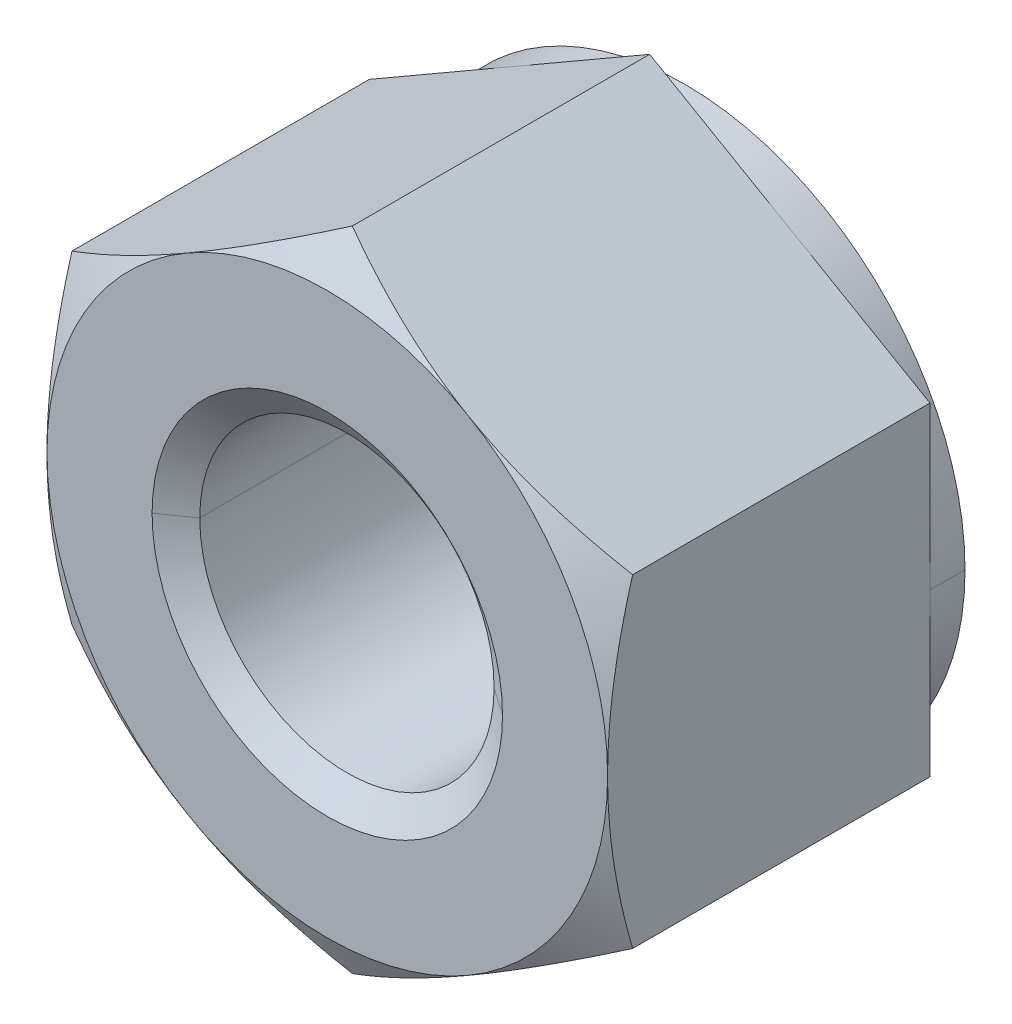
ISO-10303-21;
HEADER;
FILE_DESCRIPTION(('STEP AP214'),'2;1');
FILE_NAME('part.step','',(''),(''),'','','');
FILE_SCHEMA(('AUTOMOTIVE_DESIGN { 1 0 10303 214 1 1 1 1 }'));
ENDSEC;
DATA;
#1=APPLICATION_CONTEXT('core data for automotive mechanical design processes');
#2=APPLICATION_PROTOCOL_DEFINITION('international standard','automotive_design',2000,#1);
#3=PRODUCT_CONTEXT('',#1,'mechanical');
#4=PRODUCT('Part','Part','',(#3));
#5=PRODUCT_RELATED_PRODUCT_CATEGORY('part','',(#4));
#6=PRODUCT_DEFINITION_FORMATION('','',#4);
#7=PRODUCT_DEFINITION_CONTEXT('part definition',#1,'design');
#8=PRODUCT_DEFINITION('design','',#6,#7);
#9=PRODUCT_DEFINITION_SHAPE('','',#8);
#10=(LENGTH_UNIT() NAMED_UNIT(*) SI_UNIT(.MILLI.,.METRE.));
#11=(NAMED_UNIT(*) PLANE_ANGLE_UNIT() SI_UNIT($,.RADIAN.));
#12=(NAMED_UNIT(*) SI_UNIT($,.STERADIAN.) SOLID_ANGLE_UNIT());
#13=UNCERTAINTY_MEASURE_WITH_UNIT(LENGTH_MEASURE(1.E-05),#10,'distance_accuracy_value','');
#14=(GEOMETRIC_REPRESENTATION_CONTEXT(3) GLOBAL_UNCERTAINTY_ASSIGNED_CONTEXT((#13)) GLOBAL_UNIT_ASSIGNED_CONTEXT((#10,
#11,#12)) REPRESENTATION_CONTEXT('',''));
#15=CARTESIAN_POINT('',(0.,0.,0.));
#16=DIRECTION('',(0.,0.,1.));
#17=DIRECTION('',(1.,0.,0.));
#18=AXIS2_PLACEMENT_3D('',#15,#16,#17);
#19=CARTESIAN_POINT('',(0.,0.,-25.0375057290932));
#20=DIRECTION('',(0.,0.,1.));
#21=DIRECTION('',(1.,0.,0.));
#22=AXIS2_PLACEMENT_3D('',#19,#20,#21);
#23=CYLINDRICAL_SURFACE('',#22,2.5);
#24=DIRECTION('',(0.,0.,1.));
#25=VECTOR('',#24,1.);
#26=CARTESIAN_POINT('',(-2.5,0.,-25.0375057290932));
#27=LINE('',#26,#25);
#28=CARTESIAN_POINT('',(-2.5,0.,-5.1));
#29=VERTEX_POINT('',#28);
#30=CARTESIAN_POINT('',(-2.5,0.,-5.0746));
#31=VERTEX_POINT('',#30);
#32=EDGE_CURVE('E271',#29,#31,#27,.T.);
#33=ORIENTED_EDGE('',*,*,#32,.F.);
#34=CARTESIAN_POINT('',(0.,0.,-5.1));
#35=DIRECTION('',(0.,0.,1.));
#36=DIRECTION('',(-1.,0.,0.));
#37=AXIS2_PLACEMENT_3D('',#34,#35,#36);
#38=CIRCLE('',#37,2.5);
#39=CARTESIAN_POINT('',(2.5,0.,-5.1));
#40=VERTEX_POINT('',#39);
#41=EDGE_CURVE('E216',#40,#29,#38,.T.);
#42=ORIENTED_EDGE('',*,*,#41,.F.);
#43=DIRECTION('',(0.,0.,1.));
#44=VECTOR('',#43,1.);
#45=CARTESIAN_POINT('',(2.5,0.,-25.0375057290932));
#46=LINE('',#45,#44);
#47=CARTESIAN_POINT('',(2.5,0.,-5.0746));
#48=VERTEX_POINT('',#47);
#49=EDGE_CURVE('E288',#40,#48,#46,.T.);
#50=ORIENTED_EDGE('',*,*,#49,.T.);
#51=CARTESIAN_POINT('',(0.,0.,-5.0746));
#52=DIRECTION('',(0.,0.,1.));
#53=DIRECTION('',(1.,0.,0.));
#54=AXIS2_PLACEMENT_3D('',#51,#52,#53);
#55=CIRCLE('',#54,2.5);
#56=EDGE_CURVE('E10',#48,#31,#55,.T.);
#57=ORIENTED_EDGE('',*,*,#56,.T.);
#58=EDGE_LOOP('',(#33,#42,#50,#57));
#59=FACE_BOUND('',#58,.T.);
#60=ADVANCED_FACE('F16',(#59),#23,.F.);
#61=CARTESIAN_POINT('',(0.,0.,-5.0746));
#62=DIRECTION('',(0.,0.,-1.));
#63=DIRECTION('',(-1.,0.,0.));
#64=AXIS2_PLACEMENT_3D('',#61,#62,#63);
#65=CONICAL_SURFACE('',#64,2.5,0.959931088596885);
#66=DIRECTION('',(0.819152044288994,0.,-0.573576436351043));
#67=VECTOR('',#66,1.);
#68=CARTESIAN_POINT('',(2.5,0.,-5.0746));
#69=LINE('',#68,#67);
#70=CARTESIAN_POINT('',(2.1,0.,-4.79451698471612));
#71=VERTEX_POINT('',#70);
#72=EDGE_CURVE('E265',#71,#48,#69,.T.);
#73=ORIENTED_EDGE('',*,*,#72,.F.);
#74=CARTESIAN_POINT('',(0.,0.,-4.79451698471612));
#75=DIRECTION('',(0.,0.,1.));
#76=DIRECTION('',(-1.,0.,0.));
#77=AXIS2_PLACEMENT_3D('',#74,#75,#76);
#78=CIRCLE('',#77,2.1);
#79=CARTESIAN_POINT('',(-2.1,0.,-4.79451698471612));
#80=VERTEX_POINT('',#79);
#81=EDGE_CURVE('E245',#71,#80,#78,.T.);
#82=ORIENTED_EDGE('',*,*,#81,.T.);
#83=DIRECTION('',(-0.819152044288994,0.,-0.573576436351043));
#84=VECTOR('',#83,1.);
#85=CARTESIAN_POINT('',(-2.5,0.,-5.0746));
#86=LINE('',#85,#84);
#87=EDGE_CURVE('E269',#80,#31,#86,.T.);
#88=ORIENTED_EDGE('',*,*,#87,.T.);
#89=ORIENTED_EDGE('',*,*,#56,.F.);
#90=EDGE_LOOP('',(#73,#82,#88,#89));
#91=FACE_BOUND('',#90,.T.);
#92=ADVANCED_FACE('F679',(#91),#65,.F.);
#93=CARTESIAN_POINT('',(0.,0.,-0.308091316812268));
#94=DIRECTION('',(0.,0.,1.));
#95=DIRECTION('',(1.,0.,0.));
#96=AXIS2_PLACEMENT_3D('',#93,#94,#95);
#97=CONICAL_SURFACE('',#96,2.06,0.959931088596883);
#98=DIRECTION('',(-0.819152044288993,0.,0.573576436351045));
#99=VECTOR('',#98,1.);
#100=CARTESIAN_POINT('',(-2.06,0.,-0.308091316812268));
#101=LINE('',#100,#99);
#102=CARTESIAN_POINT('',(-2.1,0.,-0.28008301528388));
#103=VERTEX_POINT('',#102);
#104=CARTESIAN_POINT('',(-2.5,0.,0.));
#105=VERTEX_POINT('',#104);
#106=EDGE_CURVE('E283',#103,#105,#101,.T.);
#107=ORIENTED_EDGE('',*,*,#106,.F.);
#108=CARTESIAN_POINT('',(0.,0.,-0.28008301528388));
#109=DIRECTION('',(0.,0.,-1.));
#110=DIRECTION('',(1.,0.,0.));
#111=AXIS2_PLACEMENT_3D('',#108,#109,#110);
#112=CIRCLE('',#111,2.1);
#113=CARTESIAN_POINT('',(2.1,0.,-0.28008301528388));
#114=VERTEX_POINT('',#113);
#115=EDGE_CURVE('E298',#103,#114,#112,.T.);
#116=ORIENTED_EDGE('',*,*,#115,.T.);
#117=DIRECTION('',(0.819152044288993,0.,0.573576436351045));
#118=VECTOR('',#117,1.);
#119=CARTESIAN_POINT('',(2.06,0.,-0.308091316812268));
#120=LINE('',#119,#118);
#121=CARTESIAN_POINT('',(2.5,0.,0.));
#122=VERTEX_POINT('',#121);
#123=EDGE_CURVE('E230',#114,#122,#120,.T.);
#124=ORIENTED_EDGE('',*,*,#123,.T.);
#125=CARTESIAN_POINT('',(0.,0.,0.));
#126=DIRECTION('',(0.,0.,1.));
#127=DIRECTION('',(1.,0.,0.));
#128=AXIS2_PLACEMENT_3D('',#125,#126,#127);
#129=CIRCLE('',#128,2.5);
#130=EDGE_CURVE('E217',#122,#105,#129,.T.);
#131=ORIENTED_EDGE('',*,*,#130,.T.);
#132=EDGE_LOOP('',(#107,#116,#124,#131));
#133=FACE_BOUND('',#132,.T.);
#134=ADVANCED_FACE('F365',(#133),#97,.F.);
#135=CARTESIAN_POINT('',(0.,0.,0.));
#136=DIRECTION('',(0.,0.,-1.));
#137=DIRECTION('',(-1.,0.,0.));
#138=AXIS2_PLACEMENT_3D('',#135,#136,#137);
#139=CONICAL_SURFACE('',#138,4.,1.0471975511966);
#140=CARTESIAN_POINT('',(0.,0.,0.));
#141=DIRECTION('',(0.,0.,1.));
#142=DIRECTION('',(-1.,0.,0.));
#143=AXIS2_PLACEMENT_3D('',#140,#141,#142);
#144=CIRCLE('',#143,4.);
#145=CARTESIAN_POINT('',(-4.,0.,0.));
#146=VERTEX_POINT('',#145);
#147=CARTESIAN_POINT('',(-2.,-3.46410161513774,0.));
#148=VERTEX_POINT('',#147);
#149=EDGE_CURVE('E44',#146,#148,#144,.T.);
#150=ORIENTED_EDGE('',*,*,#149,.F.);
#151=CARTESIAN_POINT('',(-4.,-2.30940107675854,-0.35726558990817));
#152=CARTESIAN_POINT('',(-4.,-1.7072207189123,-0.18343109405653));
#153=CARTESIAN_POINT('',(-4.,-1.16353768418359,-0.0957198448388102));
#154=CARTESIAN_POINT('',(-4.,-0.57021292607252,0.));
#155=CARTESIAN_POINT('',(-4.,0.,0.));
#156=B_SPLINE_CURVE_WITH_KNOTS('',2,(#151,#152,#153,#154,#155),.UNSPECIFIED.,.F.,.F.,(3,2,3),
(0.,0.5,1.),.UNSPECIFIED.);
#157=CARTESIAN_POINT('',(-4.,-2.30940107675853,-0.357265589908173));
#158=VERTEX_POINT('',#157);
#159=EDGE_CURVE('E310',#158,#146,#156,.T.);
#160=ORIENTED_EDGE('',*,*,#159,.F.);
#161=CARTESIAN_POINT('',(-2.00000000000004,-3.46410161513777,0.));
#162=CARTESIAN_POINT('',(-2.49519443537938,-3.1782009745703,0.));
#163=CARTESIAN_POINT('',(-3.01152933126464,-2.88009488343894,-0.096442881237533));
#164=CARTESIAN_POINT('',(-3.48009044106804,-2.60957100056215,-0.183962403596783));
#165=CARTESIAN_POINT('',(-4.,-2.30940107675853,-0.357265589908172));
#166=B_SPLINE_CURVE_WITH_KNOTS('',2,(#161,#162,#163,#164,#165),.UNSPECIFIED.,.F.,.F.,(3,2,3),
(0.,0.5,1.),.UNSPECIFIED.);
#167=EDGE_CURVE('E451',#148,#158,#166,.T.);
#168=ORIENTED_EDGE('',*,*,#167,.F.);
#169=EDGE_LOOP('',(#150,#160,#168));
#170=FACE_BOUND('',#169,.T.);
#171=ADVANCED_FACE('F387',(#170),#139,.T.);
#172=CARTESIAN_POINT('',(0.,0.,0.));
#173=DIRECTION('',(0.,0.,-1.));
#174=DIRECTION('',(-1.,0.,0.));
#175=AXIS2_PLACEMENT_3D('',#172,#173,#174);
#176=CONICAL_SURFACE('',#175,4.,1.0471975511966);
#177=CARTESIAN_POINT('',(0.,0.,0.));
#178=DIRECTION('',(0.,0.,1.));
#179=DIRECTION('',(-1.,0.,0.));
#180=AXIS2_PLACEMENT_3D('',#177,#178,#179);
#181=CIRCLE('',#180,4.);
#182=CARTESIAN_POINT('',(2.,-3.46410161513775,0.));
#183=VERTEX_POINT('',#182);
#184=EDGE_CURVE('E409',#148,#183,#181,.T.);
#185=ORIENTED_EDGE('',*,*,#184,.F.);
#186=CARTESIAN_POINT('',(0.,-4.61880215351702,-0.357265589908172));
#187=CARTESIAN_POINT('',(-1.07179676972012,-4.00000000000258,0.));
#188=CARTESIAN_POINT('',(-2.00000000000004,-3.46410161513777,0.));
#189=B_SPLINE_CURVE_WITH_KNOTS('',2,(#186,#187,#188),.UNSPECIFIED.,.F.,.F.,(3,3),(0.,1.),.UNSPECIFIED.);
#190=CARTESIAN_POINT('',(0.,-4.61880215351702,-0.357265589908173));
#191=VERTEX_POINT('',#190);
#192=EDGE_CURVE('E279',#191,#148,#189,.T.);
#193=ORIENTED_EDGE('',*,*,#192,.F.);
#194=CARTESIAN_POINT('',(2.00000000000003,-3.46410161513779,0.));
#195=CARTESIAN_POINT('',(1.50480556462071,-3.75000225570525,0.));
#196=CARTESIAN_POINT('',(0.988470668735374,-4.04810834683664,-0.0964428812375399));
#197=CARTESIAN_POINT('',(0.519909558932138,-4.31863222971333,-0.18396240359676));
#198=CARTESIAN_POINT('',(0.,-4.61880215351708,-0.35726558990817));
#199=B_SPLINE_CURVE_WITH_KNOTS('',2,(#194,#195,#196,#197,#198),.UNSPECIFIED.,.F.,.F.,(3,2,3),
(0.,0.5,1.),.UNSPECIFIED.);
#200=EDGE_CURVE('E486',#183,#191,#199,.T.);
#201=ORIENTED_EDGE('',*,*,#200,.F.);
#202=EDGE_LOOP('',(#185,#193,#201));
#203=FACE_BOUND('',#202,.T.);
#204=ADVANCED_FACE('F397',(#203),#176,.T.);
#205=CARTESIAN_POINT('',(0.,0.,0.));
#206=DIRECTION('',(0.,0.,-1.));
#207=DIRECTION('',(-1.,0.,0.));
#208=AXIS2_PLACEMENT_3D('',#205,#206,#207);
#209=CONICAL_SURFACE('',#208,4.,1.0471975511966);
#210=CARTESIAN_POINT('',(4.,-2.30940107675854,-0.357265589908173));
#211=CARTESIAN_POINT('',(3.99999954238795,-2.2442318398896,-0.338453330382027));
#212=CARTESIAN_POINT('',(3.9999887576251,-2.17890332379629,-0.320185741734895));
#213=CARTESIAN_POINT('',(3.99996132889915,-2.0490964385629,-0.285160596964171));
#214=CARTESIAN_POINT('',(3.99994479323789,-1.98462377574344,-0.268381868954914));
#215=CARTESIAN_POINT('',(3.99991981307897,-1.85639678522215,-0.236332731108733));
#216=CARTESIAN_POINT('',(3.99991124363065,-1.79264742037732,-0.22104251885695));
#217=CARTESIAN_POINT('',(3.99990824482169,-1.66572396889549,-0.191968912857029));
#218=CARTESIAN_POINT('',(3.99991362343021,-1.60255395933187,-0.178167751770797));
#219=CARTESIAN_POINT('',(3.99993710035011,-1.4766332456285,-0.15207057441378));
#220=CARTESIAN_POINT('',(3.99995505702656,-1.41388565381928,-0.139759571691062));
#221=CARTESIAN_POINT('',(3.99998502686235,-1.28864244223895,-0.116637389305467));
#222=CARTESIAN_POINT('',(3.99999708721268,-1.22614892912232,-0.105814816675757));
#223=CARTESIAN_POINT('',(4.00000300398586,-1.09896609932303,-0.0853088023611843));
#224=CARTESIAN_POINT('',(3.99999627862628,-1.03426929492968,-0.0756716358815177));
#225=CARTESIAN_POINT('',(3.99999829798884,-0.905202744879515,-0.0581207554754691));
#226=CARTESIAN_POINT('',(4.00000691146595,-0.840834905421251,-0.0501930645976879));
#227=CARTESIAN_POINT('',(4.00002970026466,-0.712178861476603,-0.0360530450928879));
#228=CARTESIAN_POINT('',(4.00004385255331,-0.64789141925504,-0.0298337919636415));
#229=CARTESIAN_POINT('',(4.00004166385898,-0.518590236604422,-0.0190561099578061));
#230=CARTESIAN_POINT('',(4.000025045353,-0.453575194174983,-0.0145132439695878));
#231=CARTESIAN_POINT('',(4.00000174023311,-0.323814563939056,-0.00725795890209394));
#232=CARTESIAN_POINT('',(3.99999499751375,-0.259069554206733,-0.0045352477421511));
#233=CARTESIAN_POINT('',(3.99999072689738,-0.129549848997073,-0.000902955773671567));
#234=CARTESIAN_POINT('',(3.99999319600746,-0.0647751699969749,7.21377938250247E-06));
#235=CARTESIAN_POINT('',(4.,0.,0.));
#236=B_SPLINE_CURVE_WITH_KNOTS('',3,(#210,#211,#212,#213,#214,#215,#216,#217,#218,#219,#220,
#221,#222,#223,#224,#225,#226,#227,#228,#229,#230,#231,#232,#233,#234,#235),.UNSPECIFIED.,.F.,
.F.,(4,2,2,2,2,2,2,2,2,2,2,2,4),(0.,0.203490992195747,0.403340583837692,0.599999844287542,
0.793966003610969,0.985782408747984,1.17603740926835,1.37224923868129,1.56679026172411,
1.76053074516323,1.95602709875104,2.15040844924514,2.34472665104667),.UNSPECIFIED.);
#237=CARTESIAN_POINT('',(4.,-2.30940107675855,-0.357265589908173));
#238=VERTEX_POINT('',#237);
#239=CARTESIAN_POINT('',(4.,0.,0.));
#240=VERTEX_POINT('',#239);
#241=EDGE_CURVE('E292',#238,#240,#236,.T.);
#242=ORIENTED_EDGE('',*,*,#241,.T.);
#243=CARTESIAN_POINT('',(0.,0.,0.));
#244=DIRECTION('',(0.,0.,1.));
#245=DIRECTION('',(-1.,0.,0.));
#246=AXIS2_PLACEMENT_3D('',#243,#244,#245);
#247=CIRCLE('',#246,4.);
#248=EDGE_CURVE('E72',#183,#240,#247,.T.);
#249=ORIENTED_EDGE('',*,*,#248,.F.);
#250=CARTESIAN_POINT('',(3.99999999999999,-2.30940107675856,-0.35726558990817));
#251=CARTESIAN_POINT('',(2.92820323027995,-2.928203230273,0.));
#252=CARTESIAN_POINT('',(2.00000000000003,-3.46410161513779,0.));
#253=B_SPLINE_CURVE_WITH_KNOTS('',2,(#250,#251,#252),.UNSPECIFIED.,.F.,.F.,(3,3),(0.,1.),.UNSPECIFIED.);
#254=EDGE_CURVE('E498',#238,#183,#253,.T.);
#255=ORIENTED_EDGE('',*,*,#254,.F.);
#256=EDGE_LOOP('',(#242,#249,#255));
#257=FACE_BOUND('',#256,.T.);
#258=ADVANCED_FACE('F776',(#257),#209,.T.);
#259=CARTESIAN_POINT('',(0.,0.,0.));
#260=DIRECTION('',(0.,0.,-1.));
#261=DIRECTION('',(-1.,0.,0.));
#262=AXIS2_PLACEMENT_3D('',#259,#260,#261);
#263=CONICAL_SURFACE('',#262,4.,1.0471975511966);
#264=CARTESIAN_POINT('',(0.,0.,0.));
#265=DIRECTION('',(0.,0.,1.));
#266=DIRECTION('',(1.,0.,0.));
#267=AXIS2_PLACEMENT_3D('',#264,#265,#266);
#268=CIRCLE('',#267,4.);
#269=CARTESIAN_POINT('',(2.00000000000003,3.46410161513774,0.));
#270=VERTEX_POINT('',#269);
#271=EDGE_CURVE('E584',#240,#270,#268,.T.);
#272=ORIENTED_EDGE('',*,*,#271,.F.);
#273=CARTESIAN_POINT('',(4.,0.,0.));
#274=CARTESIAN_POINT('',(3.99999270885993,0.0651691618111691,7.57135877197369E-06));
#275=CARTESIAN_POINT('',(3.99999858334609,0.130337592604713,-0.00091857652574523));
#276=CARTESIAN_POINT('',(4.00002488234885,0.260722669278008,-0.00460998219876775));
#277=CARTESIAN_POINT('',(4.0000453292005,0.325939235463857,-0.0073780626829641));
#278=CARTESIAN_POINT('',(4.00008909492442,0.456728081598989,-0.0147506772173266));
#279=CARTESIAN_POINT('',(4.0001124329852,0.522299637258695,-0.0193679908050121));
#280=CARTESIAN_POINT('',(4.0001125005147,0.652669756610998,-0.0303111098340255));
#281=CARTESIAN_POINT('',(4.00008967236775,0.717469728299184,-0.0366202013886025));
#282=CARTESIAN_POINT('',(4.00004642206242,0.847100552589534,-0.0509583367241715));
#283=CARTESIAN_POINT('',(4.0000260082968,0.911930769312261,-0.0589931216853799));
#284=CARTESIAN_POINT('',(4.00000572875965,1.04187495305032,-0.0767767119378173));
#285=CARTESIAN_POINT('',(4.00000602599138,1.10698713687344,-0.0865385109111744));
#286=CARTESIAN_POINT('',(3.99999423706425,1.23411920627131,-0.107169966481229));
#287=CARTESIAN_POINT('',(3.99998269091735,1.29615000187903,-0.117972658854136));
#288=CARTESIAN_POINT('',(3.99995334418437,1.42047069467895,-0.141032220140265));
#289=CARTESIAN_POINT('',(3.99993549269722,1.48275849640549,-0.153300369226731));
#290=CARTESIAN_POINT('',(3.99991263255173,1.60775819765095,-0.179289976085411));
#291=CARTESIAN_POINT('',(3.99990777010018,1.67046702430475,-0.193026183371088));
#292=CARTESIAN_POINT('',(3.99991145682637,1.79646287658493,-0.221947911992026));
#293=CARTESIAN_POINT('',(3.99992019252353,1.85974589535561,-0.23715085844181));
#294=CARTESIAN_POINT('',(3.99994525486249,1.98703147922929,-0.269003653632232));
#295=CARTESIAN_POINT('',(3.99996170170717,2.05102917972727,-0.285672889869032));
#296=CARTESIAN_POINT('',(3.99998891284823,2.17987429888387,-0.320457273127559));
#297=CARTESIAN_POINT('',(3.99999956890973,2.24471613287998,-0.33859312913503));
#298=CARTESIAN_POINT('',(4.,2.30940107675853,-0.357265589908173));
#299=B_SPLINE_CURVE_WITH_KNOTS('',3,(#273,#274,#275,#276,#277,#278,#279,#280,#281,#282,#283,
#284,#285,#286,#287,#288,#289,#290,#291,#292,#293,#294,#295,#296,#297,#298),.UNSPECIFIED.,.F.,
.F.,(4,2,2,2,2,2,2,2,2,2,2,2,4),(0.,0.195499625509643,0.391299539288929,0.5884765876498,
0.783773154648294,0.979729803000755,1.17722887603189,1.36610642297927,1.55654494490266,
1.74911821622973,1.94435629061868,2.14274445698229,2.34472321580686),.UNSPECIFIED.);
#300=CARTESIAN_POINT('',(4.,2.30940107675853,-0.357265589908173));
#301=VERTEX_POINT('',#300);
#302=EDGE_CURVE('E254',#240,#301,#299,.T.);
#303=ORIENTED_EDGE('',*,*,#302,.T.);
#304=CARTESIAN_POINT('',(2.00000000000002,3.46410161513774,0.));
#305=CARTESIAN_POINT('',(2.49519443537926,3.17820097457033,0.));
#306=CARTESIAN_POINT('',(3.01152933126463,2.88009488343891,-0.0964428812375104));
#307=CARTESIAN_POINT('',(3.48009044106785,2.60957100056222,-0.18396240359669));
#308=CARTESIAN_POINT('',(3.99999999999998,2.30940107675849,-0.35726558990817));
#309=B_SPLINE_CURVE_WITH_KNOTS('',2,(#304,#305,#306,#307,#308),.UNSPECIFIED.,.F.,.F.,(3,2,3),
(0.,0.5,1.),.UNSPECIFIED.);
#310=EDGE_CURVE('E542',#270,#301,#309,.T.);
#311=ORIENTED_EDGE('',*,*,#310,.F.);
#312=EDGE_LOOP('',(#272,#303,#311));
#313=FACE_BOUND('',#312,.T.);
#314=ADVANCED_FACE('F780',(#313),#263,.T.);
#315=CARTESIAN_POINT('',(0.,0.,0.));
#316=DIRECTION('',(0.,0.,-1.));
#317=DIRECTION('',(-1.,0.,0.));
#318=AXIS2_PLACEMENT_3D('',#315,#316,#317);
#319=CONICAL_SURFACE('',#318,4.,1.0471975511966);
#320=CARTESIAN_POINT('',(0.,0.,0.));
#321=DIRECTION('',(0.,0.,1.));
#322=DIRECTION('',(-1.,0.,0.));
#323=AXIS2_PLACEMENT_3D('',#320,#321,#322);
#324=CIRCLE('',#323,4.);
#325=CARTESIAN_POINT('',(-2.,3.46410161513775,0.));
#326=VERTEX_POINT('',#325);
#327=EDGE_CURVE('E606',#270,#326,#324,.T.);
#328=ORIENTED_EDGE('',*,*,#327,.F.);
#329=CARTESIAN_POINT('',(0.,4.61880215351702,-0.35726558990817));
#330=CARTESIAN_POINT('',(1.07179676972002,4.00000000000259,0.));
#331=CARTESIAN_POINT('',(2.00000000000002,3.46410161513774,0.));
#332=B_SPLINE_CURVE_WITH_KNOTS('',2,(#329,#330,#331),.UNSPECIFIED.,.F.,.F.,(3,3),(0.,1.),.UNSPECIFIED.);
#333=CARTESIAN_POINT('',(0.,4.61880215351702,-0.357265589908173));
#334=VERTEX_POINT('',#333);
#335=EDGE_CURVE('E321',#334,#270,#332,.T.);
#336=ORIENTED_EDGE('',*,*,#335,.F.);
#337=CARTESIAN_POINT('',(-2.00000000000001,3.46410161513776,0.));
#338=CARTESIAN_POINT('',(-1.50480556462314,3.7500022557038,0.));
#339=CARTESIAN_POINT('',(-0.988470668735377,4.04810834683659,-0.0964428812375104));
#340=CARTESIAN_POINT('',(-0.519909558934969,4.31863222971165,-0.183962403595771));
#341=CARTESIAN_POINT('',(0.,4.61880215351702,-0.35726558990817));
#342=B_SPLINE_CURVE_WITH_KNOTS('',2,(#337,#338,#339,#340,#341),.UNSPECIFIED.,.F.,.F.,(3,2,3),
(0.,0.5,1.),.UNSPECIFIED.);
#343=EDGE_CURVE('E510',#326,#334,#342,.T.);
#344=ORIENTED_EDGE('',*,*,#343,.F.);
#345=EDGE_LOOP('',(#328,#336,#344));
#346=FACE_BOUND('',#345,.T.);
#347=ADVANCED_FACE('F708',(#346),#319,.T.);
#348=CARTESIAN_POINT('',(0.,0.,0.));
#349=DIRECTION('',(0.,0.,-1.));
#350=DIRECTION('',(-1.,0.,0.));
#351=AXIS2_PLACEMENT_3D('',#348,#349,#350);
#352=CONICAL_SURFACE('',#351,4.,1.0471975511966);
#353=CARTESIAN_POINT('',(-4.,0.,0.));
#354=CARTESIAN_POINT('',(-4.,0.57365965646873,0.));
#355=CARTESIAN_POINT('',(-4.,1.17197157061065,-0.0970844216616612));
#356=CARTESIAN_POINT('',(-4.,1.71121513625145,-0.184584183019561));
#357=CARTESIAN_POINT('',(-4.,2.30940107675849,-0.35726558990817));
#358=B_SPLINE_CURVE_WITH_KNOTS('',2,(#353,#354,#355,#356,#357),.UNSPECIFIED.,.F.,.F.,(3,2,3),
(0.,0.5,1.),.UNSPECIFIED.);
#359=CARTESIAN_POINT('',(-4.,2.30940107675849,-0.357265589908173));
#360=VERTEX_POINT('',#359);
#361=EDGE_CURVE('E259',#146,#360,#358,.T.);
#362=ORIENTED_EDGE('',*,*,#361,.F.);
#363=CARTESIAN_POINT('',(0.,0.,0.));
#364=DIRECTION('',(0.,0.,1.));
#365=DIRECTION('',(-1.,0.,0.));
#366=AXIS2_PLACEMENT_3D('',#363,#364,#365);
#367=CIRCLE('',#366,4.);
#368=EDGE_CURVE('E324',#326,#146,#367,.T.);
#369=ORIENTED_EDGE('',*,*,#368,.F.);
#370=CARTESIAN_POINT('',(-4.,2.3094010767585,-0.35726558990817));
#371=CARTESIAN_POINT('',(-2.92820323028003,2.92820323027291,0.));
#372=CARTESIAN_POINT('',(-2.00000000000001,3.46410161513776,0.));
#373=B_SPLINE_CURVE_WITH_KNOTS('',2,(#370,#371,#372),.UNSPECIFIED.,.F.,.F.,(3,3),(0.,1.),.UNSPECIFIED.);
#374=EDGE_CURVE('E635',#360,#326,#373,.T.);
#375=ORIENTED_EDGE('',*,*,#374,.F.);
#376=EDGE_LOOP('',(#362,#369,#375));
#377=FACE_BOUND('',#376,.T.);
#378=ADVANCED_FACE('F704',(#377),#352,.T.);
#379=CARTESIAN_POINT('',(0.,14.618802153517,-4.6));
#380=DIRECTION('',(0.,0.,-1.));
#381=DIRECTION('',(0.,-1.,0.));
#382=AXIS2_PLACEMENT_3D('',#379,#380,#381);
#383=PLANE('',#382);
#384=DIRECTION('',(0.,-1.,0.));
#385=VECTOR('',#384,1.);
#386=CARTESIAN_POINT('',(-4.,2.30940107675849,-4.6));
#387=LINE('',#386,#385);
#388=CARTESIAN_POINT('',(-4.,0.,-4.6));
#389=VERTEX_POINT('',#388);
#390=CARTESIAN_POINT('',(-4.,-2.30940107675853,-4.6));
#391=VERTEX_POINT('',#390);
#392=EDGE_CURVE('E258',#389,#391,#387,.T.);
#393=ORIENTED_EDGE('',*,*,#392,.F.);
#394=CARTESIAN_POINT('',(0.,0.,-4.6));
#395=DIRECTION('',(0.,0.,1.));
#396=DIRECTION('',(1.,0.,0.));
#397=AXIS2_PLACEMENT_3D('',#394,#395,#396);
#398=CIRCLE('',#397,4.);
#399=CARTESIAN_POINT('',(-2.00000000000004,-3.46410161513777,-4.6));
#400=VERTEX_POINT('',#399);
#401=EDGE_CURVE('E29',#389,#400,#398,.T.);
#402=ORIENTED_EDGE('',*,*,#401,.T.);
#403=DIRECTION('',(0.866025403784435,-0.500000000000006,0.));
#404=VECTOR('',#403,1.);
#405=CARTESIAN_POINT('',(-4.,-2.30940107675853,-4.6));
#406=LINE('',#405,#404);
#407=EDGE_CURVE('E305',#391,#400,#406,.T.);
#408=ORIENTED_EDGE('',*,*,#407,.F.);
#409=EDGE_LOOP('',(#393,#402,#408));
#410=FACE_BOUND('',#409,.T.);
#411=ADVANCED_FACE('F398',(#410),#383,.T.);
#412=CARTESIAN_POINT('',(0.,0.,0.));
#413=DIRECTION('',(0.,0.,1.));
#414=DIRECTION('',(1.,0.,0.));
#415=AXIS2_PLACEMENT_3D('',#412,#413,#414);
#416=CYLINDRICAL_SURFACE('',#415,4.);
#417=DIRECTION('',(0.,0.,1.));
#418=VECTOR('',#417,1.);
#419=CARTESIAN_POINT('',(-4.,0.,0.));
#420=LINE('',#419,#418);
#421=CARTESIAN_POINT('',(-4.,0.,-5.1));
#422=VERTEX_POINT('',#421);
#423=EDGE_CURVE('E211',#422,#389,#420,.T.);
#424=ORIENTED_EDGE('',*,*,#423,.F.);
#425=CARTESIAN_POINT('',(0.,0.,-5.1));
#426=DIRECTION('',(0.,0.,1.));
#427=DIRECTION('',(-1.,0.,0.));
#428=AXIS2_PLACEMENT_3D('',#425,#426,#427);
#429=CIRCLE('',#428,4.);
#430=CARTESIAN_POINT('',(4.,0.,-5.1));
#431=VERTEX_POINT('',#430);
#432=EDGE_CURVE('E205',#422,#431,#429,.T.);
#433=ORIENTED_EDGE('',*,*,#432,.T.);
#434=DIRECTION('',(0.,0.,1.));
#435=VECTOR('',#434,1.);
#436=CARTESIAN_POINT('',(4.,0.,0.));
#437=LINE('',#436,#435);
#438=CARTESIAN_POINT('',(4.,0.,-4.6));
#439=VERTEX_POINT('',#438);
#440=EDGE_CURVE('E208',#431,#439,#437,.T.);
#441=ORIENTED_EDGE('',*,*,#440,.T.);
#442=CARTESIAN_POINT('',(0.,0.,-4.6));
#443=DIRECTION('',(0.,0.,1.));
#444=DIRECTION('',(1.,0.,0.));
#445=AXIS2_PLACEMENT_3D('',#442,#443,#444);
#446=CIRCLE('',#445,4.);
#447=CARTESIAN_POINT('',(2.00000000000003,-3.46410161513779,-4.6));
#448=VERTEX_POINT('',#447);
#449=EDGE_CURVE('E331',#448,#439,#446,.T.);
#450=ORIENTED_EDGE('',*,*,#449,.F.);
#451=CARTESIAN_POINT('',(0.,0.,-4.6));
#452=DIRECTION('',(0.,0.,1.));
#453=DIRECTION('',(1.,0.,0.));
#454=AXIS2_PLACEMENT_3D('',#451,#452,#453);
#455=CIRCLE('',#454,4.);
#456=EDGE_CURVE('E115',#400,#448,#455,.T.);
#457=ORIENTED_EDGE('',*,*,#456,.F.);
#458=ORIENTED_EDGE('',*,*,#401,.F.);
#459=EDGE_LOOP('',(#424,#433,#441,#450,#457,#458));
#460=FACE_BOUND('',#459,.T.);
#461=ADVANCED_FACE('F207',(#460),#416,.T.);
#462=CARTESIAN_POINT('',(0.,14.618802153517,-4.6));
#463=DIRECTION('',(0.,0.,-1.));
#464=DIRECTION('',(0.,-1.,0.));
#465=AXIS2_PLACEMENT_3D('',#462,#463,#464);
#466=PLANE('',#465);
#467=CARTESIAN_POINT('',(0.,0.,-4.6));
#468=DIRECTION('',(0.,0.,1.));
#469=DIRECTION('',(1.,0.,0.));
#470=AXIS2_PLACEMENT_3D('',#467,#468,#469);
#471=CIRCLE('',#470,4.);
#472=CARTESIAN_POINT('',(-2.,3.46410161513775,-4.6));
#473=VERTEX_POINT('',#472);
#474=EDGE_CURVE('E237',#473,#389,#471,.T.);
#475=ORIENTED_EDGE('',*,*,#474,.T.);
#476=DIRECTION('',(0.,-1.,0.));
#477=VECTOR('',#476,1.);
#478=CARTESIAN_POINT('',(-4.,2.30940107675849,-4.6));
#479=LINE('',#478,#477);
#480=CARTESIAN_POINT('',(-4.,2.30940107675849,-4.6));
#481=VERTEX_POINT('',#480);
#482=EDGE_CURVE('E255',#481,#389,#479,.T.);
#483=ORIENTED_EDGE('',*,*,#482,.F.);
#484=DIRECTION('',(-0.866025403784437,-0.5,0.));
#485=VECTOR('',#484,1.);
#486=CARTESIAN_POINT('',(0.,4.61880215351702,-4.6));
#487=LINE('',#486,#485);
#488=EDGE_CURVE('E316',#473,#481,#487,.T.);
#489=ORIENTED_EDGE('',*,*,#488,.F.);
#490=EDGE_LOOP('',(#475,#483,#489));
#491=FACE_BOUND('',#490,.T.);
#492=ADVANCED_FACE('F18',(#491),#466,.T.);
#493=CARTESIAN_POINT('',(0.,14.618802153517,-4.6));
#494=DIRECTION('',(0.,0.,-1.));
#495=DIRECTION('',(0.,-1.,0.));
#496=AXIS2_PLACEMENT_3D('',#493,#494,#495);
#497=PLANE('',#496);
#498=DIRECTION('',(0.866025403784435,-0.500000000000006,0.));
#499=VECTOR('',#498,1.);
#500=CARTESIAN_POINT('',(-4.,-2.30940107675853,-4.6));
#501=LINE('',#500,#499);
#502=CARTESIAN_POINT('',(0.,-4.61880215351706,-4.6));
#503=VERTEX_POINT('',#502);
#504=EDGE_CURVE('E130',#400,#503,#501,.T.);
#505=ORIENTED_EDGE('',*,*,#504,.F.);
#506=ORIENTED_EDGE('',*,*,#456,.T.);
#507=DIRECTION('',(0.866025403784437,0.5,0.));
#508=VECTOR('',#507,1.);
#509=CARTESIAN_POINT('',(0.,-4.61880215351706,-4.6));
#510=LINE('',#509,#508);
#511=EDGE_CURVE('E280',#503,#448,#510,.T.);
#512=ORIENTED_EDGE('',*,*,#511,.F.);
#513=EDGE_LOOP('',(#505,#506,#512));
#514=FACE_BOUND('',#513,.T.);
#515=ADVANCED_FACE('F737',(#514),#497,.T.);
#516=CARTESIAN_POINT('',(0.,14.618802153517,-4.6));
#517=DIRECTION('',(0.,0.,-1.));
#518=DIRECTION('',(0.,-1.,0.));
#519=AXIS2_PLACEMENT_3D('',#516,#517,#518);
#520=PLANE('',#519);
#521=CARTESIAN_POINT('',(0.,0.,-4.6));
#522=DIRECTION('',(0.,0.,1.));
#523=DIRECTION('',(1.,0.,0.));
#524=AXIS2_PLACEMENT_3D('',#521,#522,#523);
#525=CIRCLE('',#524,4.);
#526=CARTESIAN_POINT('',(2.00000000000003,3.46410161513774,-4.6));
#527=VERTEX_POINT('',#526);
#528=EDGE_CURVE('E261',#527,#473,#525,.T.);
#529=ORIENTED_EDGE('',*,*,#528,.T.);
#530=DIRECTION('',(-0.866025403784437,-0.5,0.));
#531=VECTOR('',#530,1.);
#532=CARTESIAN_POINT('',(0.,4.61880215351702,-4.6));
#533=LINE('',#532,#531);
#534=CARTESIAN_POINT('',(0.,4.61880215351702,-4.6));
#535=VERTEX_POINT('',#534);
#536=EDGE_CURVE('E312',#535,#473,#533,.T.);
#537=ORIENTED_EDGE('',*,*,#536,.F.);
#538=DIRECTION('',(-0.866025403784435,0.500000000000007,0.));
#539=VECTOR('',#538,1.);
#540=CARTESIAN_POINT('',(4.,2.30940107675848,-4.6));
#541=LINE('',#540,#539);
#542=EDGE_CURVE('E289',#527,#535,#541,.T.);
#543=ORIENTED_EDGE('',*,*,#542,.F.);
#544=EDGE_LOOP('',(#529,#537,#543));
#545=FACE_BOUND('',#544,.T.);
#546=ADVANCED_FACE('F729',(#545),#520,.T.);
#547=CARTESIAN_POINT('',(0.,14.618802153517,-4.6));
#548=DIRECTION('',(0.,0.,-1.));
#549=DIRECTION('',(0.,-1.,0.));
#550=AXIS2_PLACEMENT_3D('',#547,#548,#549);
#551=PLANE('',#550);
#552=DIRECTION('',(0.,-1.,0.));
#553=VECTOR('',#552,1.);
#554=CARTESIAN_POINT('',(4.,2.30940107675848,-4.6));
#555=LINE('',#554,#553);
#556=CARTESIAN_POINT('',(4.,-2.30940107675854,-4.6));
#557=VERTEX_POINT('',#556);
#558=EDGE_CURVE('E247',#439,#557,#555,.T.);
#559=ORIENTED_EDGE('',*,*,#558,.T.);
#560=DIRECTION('',(0.866025403784437,0.5,0.));
#561=VECTOR('',#560,1.);
#562=CARTESIAN_POINT('',(0.,-4.61880215351706,-4.6));
#563=LINE('',#562,#561);
#564=EDGE_CURVE('E89',#448,#557,#563,.T.);
#565=ORIENTED_EDGE('',*,*,#564,.F.);
#566=ORIENTED_EDGE('',*,*,#449,.T.);
#567=EDGE_LOOP('',(#559,#565,#566));
#568=FACE_BOUND('',#567,.T.);
#569=ADVANCED_FACE('F366',(#568),#551,.T.);
#570=CARTESIAN_POINT('',(0.,14.618802153517,-4.6));
#571=DIRECTION('',(0.,0.,-1.));
#572=DIRECTION('',(0.,-1.,0.));
#573=AXIS2_PLACEMENT_3D('',#570,#571,#572);
#574=PLANE('',#573);
#575=DIRECTION('',(0.,-1.,0.));
#576=VECTOR('',#575,1.);
#577=CARTESIAN_POINT('',(4.,2.30940107675848,-4.6));
#578=LINE('',#577,#576);
#579=CARTESIAN_POINT('',(4.,2.30940107675848,-4.6));
#580=VERTEX_POINT('',#579);
#581=EDGE_CURVE('E249',#580,#439,#578,.T.);
#582=ORIENTED_EDGE('',*,*,#581,.T.);
#583=CARTESIAN_POINT('',(0.,0.,-4.6));
#584=DIRECTION('',(0.,0.,1.));
#585=DIRECTION('',(1.,0.,0.));
#586=AXIS2_PLACEMENT_3D('',#583,#584,#585);
#587=CIRCLE('',#586,4.);
#588=EDGE_CURVE('E224',#439,#527,#587,.T.);
#589=ORIENTED_EDGE('',*,*,#588,.T.);
#590=DIRECTION('',(-0.866025403784435,0.500000000000007,0.));
#591=VECTOR('',#590,1.);
#592=CARTESIAN_POINT('',(4.,2.30940107675848,-4.6));
#593=LINE('',#592,#591);
#594=EDGE_CURVE('E293',#580,#527,#593,.T.);
#595=ORIENTED_EDGE('',*,*,#594,.F.);
#596=EDGE_LOOP('',(#582,#589,#595));
#597=FACE_BOUND('',#596,.T.);
#598=ADVANCED_FACE('F728',(#597),#574,.T.);
#599=CARTESIAN_POINT('',(0.,4.61880215351702,-5.1));
#600=DIRECTION('',(0.,0.,-1.));
#601=DIRECTION('',(0.,-1.,0.));
#602=AXIS2_PLACEMENT_3D('',#599,#600,#601);
#603=PLANE('',#602);
#604=ORIENTED_EDGE('',*,*,#41,.T.);
#605=CARTESIAN_POINT('',(0.,0.,-5.1));
#606=DIRECTION('',(0.,0.,1.));
#607=DIRECTION('',(-1.,0.,0.));
#608=AXIS2_PLACEMENT_3D('',#605,#606,#607);
#609=CIRCLE('',#608,2.5);
#610=EDGE_CURVE('E276',#29,#40,#609,.T.);
#611=ORIENTED_EDGE('',*,*,#610,.T.);
#612=EDGE_LOOP('',(#604,#611));
#613=FACE_BOUND('',#612,.T.);
#614=CARTESIAN_POINT('',(0.,0.,-5.1));
#615=DIRECTION('',(0.,0.,1.));
#616=DIRECTION('',(-1.,0.,0.));
#617=AXIS2_PLACEMENT_3D('',#614,#615,#616);
#618=CIRCLE('',#617,4.);
#619=EDGE_CURVE('E221',#431,#422,#618,.T.);
#620=ORIENTED_EDGE('',*,*,#619,.F.);
#621=ORIENTED_EDGE('',*,*,#432,.F.);
#622=EDGE_LOOP('',(#620,#621));
#623=FACE_BOUND('',#622,.T.);
#624=ADVANCED_FACE('F228',(#613,#623),#603,.T.);
#625=CARTESIAN_POINT('',(0.,4.61880215351702,0.));
#626=DIRECTION('',(0.,0.,-1.));
#627=DIRECTION('',(0.,-1.,0.));
#628=AXIS2_PLACEMENT_3D('',#625,#626,#627);
#629=PLANE('',#628);
#630=ORIENTED_EDGE('',*,*,#130,.F.);
#631=CARTESIAN_POINT('',(0.,0.,0.));
#632=DIRECTION('',(0.,0.,1.));
#633=DIRECTION('',(1.,0.,0.));
#634=AXIS2_PLACEMENT_3D('',#631,#632,#633);
#635=CIRCLE('',#634,2.5);
#636=EDGE_CURVE('E241',#105,#122,#635,.T.);
#637=ORIENTED_EDGE('',*,*,#636,.F.);
#638=EDGE_LOOP('',(#630,#637));
#639=FACE_BOUND('',#638,.T.);
#640=ORIENTED_EDGE('',*,*,#368,.T.);
#641=ORIENTED_EDGE('',*,*,#149,.T.);
#642=ORIENTED_EDGE('',*,*,#184,.T.);
#643=ORIENTED_EDGE('',*,*,#248,.T.);
#644=ORIENTED_EDGE('',*,*,#271,.T.);
#645=ORIENTED_EDGE('',*,*,#327,.T.);
#646=EDGE_LOOP('',(#640,#641,#642,#643,#644,#645));
#647=FACE_BOUND('',#646,.T.);
#648=ADVANCED_FACE('F364',(#639,#647),#629,.F.);
#649=CARTESIAN_POINT('',(-4.,2.30940107675849,-5.1));
#650=DIRECTION('',(-1.,0.,0.));
#651=DIRECTION('',(0.,0.,1.));
#652=AXIS2_PLACEMENT_3D('',#649,#650,#651);
#653=PLANE('',#652);
#654=DIRECTION('',(0.,0.,1.));
#655=VECTOR('',#654,1.);
#656=CARTESIAN_POINT('',(-4.,-2.30940107675853,-5.1));
#657=LINE('',#656,#655);
#658=EDGE_CURVE('E308',#391,#158,#657,.T.);
#659=ORIENTED_EDGE('',*,*,#658,.T.);
#660=ORIENTED_EDGE('',*,*,#159,.T.);
#661=ORIENTED_EDGE('',*,*,#361,.T.);
#662=DIRECTION('',(0.,0.,1.));
#663=VECTOR('',#662,1.);
#664=CARTESIAN_POINT('',(-4.,2.30940107675849,-5.1));
#665=LINE('',#664,#663);
#666=EDGE_CURVE('E301',#481,#360,#665,.T.);
#667=ORIENTED_EDGE('',*,*,#666,.F.);
#668=ORIENTED_EDGE('',*,*,#482,.T.);
#669=ORIENTED_EDGE('',*,*,#392,.T.);
#670=EDGE_LOOP('',(#659,#660,#661,#667,#668,#669));
#671=FACE_BOUND('',#670,.T.);
#672=ADVANCED_FACE('F353',(#671),#653,.T.);
#673=CARTESIAN_POINT('',(-4.,-2.30940107675853,-5.1));
#674=DIRECTION('',(-0.500000000000006,-0.866025403784435,0.));
#675=DIRECTION('',(-0.866025403784435,0.500000000000006,0.));
#676=AXIS2_PLACEMENT_3D('',#673,#674,#675);
#677=PLANE('',#676);
#678=DIRECTION('',(0.,0.,1.));
#679=VECTOR('',#678,1.);
#680=CARTESIAN_POINT('',(0.,-4.61880215351706,-5.1));
#681=LINE('',#680,#679);
#682=EDGE_CURVE('E334',#503,#191,#681,.T.);
#683=ORIENTED_EDGE('',*,*,#682,.T.);
#684=ORIENTED_EDGE('',*,*,#192,.T.);
#685=ORIENTED_EDGE('',*,*,#167,.T.);
#686=ORIENTED_EDGE('',*,*,#658,.F.);
#687=ORIENTED_EDGE('',*,*,#407,.T.);
#688=ORIENTED_EDGE('',*,*,#504,.T.);
#689=EDGE_LOOP('',(#683,#684,#685,#686,#687,#688));
#690=FACE_BOUND('',#689,.T.);
#691=ADVANCED_FACE('F363',(#690),#677,.T.);
#692=CARTESIAN_POINT('',(0.,-4.61880215351706,-5.1));
#693=DIRECTION('',(0.5,-0.866025403784437,0.));
#694=DIRECTION('',(0.,0.,-1.));
#695=AXIS2_PLACEMENT_3D('',#692,#693,#694);
#696=PLANE('',#695);
#697=DIRECTION('',(0.,0.,1.));
#698=VECTOR('',#697,1.);
#699=CARTESIAN_POINT('',(4.,-2.30940107675854,-5.1));
#700=LINE('',#699,#698);
#701=EDGE_CURVE('E250',#557,#238,#700,.T.);
#702=ORIENTED_EDGE('',*,*,#701,.T.);
#703=ORIENTED_EDGE('',*,*,#254,.T.);
#704=ORIENTED_EDGE('',*,*,#200,.T.);
#705=ORIENTED_EDGE('',*,*,#682,.F.);
#706=ORIENTED_EDGE('',*,*,#511,.T.);
#707=ORIENTED_EDGE('',*,*,#564,.T.);
#708=EDGE_LOOP('',(#702,#703,#704,#705,#706,#707));
#709=FACE_BOUND('',#708,.T.);
#710=ADVANCED_FACE('F436',(#709),#696,.T.);
#711=CARTESIAN_POINT('',(4.,2.30940107675848,-5.1));
#712=DIRECTION('',(-1.,0.,0.));
#713=DIRECTION('',(0.,0.,1.));
#714=AXIS2_PLACEMENT_3D('',#711,#712,#713);
#715=PLANE('',#714);
#716=ORIENTED_EDGE('',*,*,#241,.F.);
#717=ORIENTED_EDGE('',*,*,#701,.F.);
#718=ORIENTED_EDGE('',*,*,#558,.F.);
#719=ORIENTED_EDGE('',*,*,#581,.F.);
#720=DIRECTION('',(0.,0.,1.));
#721=VECTOR('',#720,1.);
#722=CARTESIAN_POINT('',(4.,2.30940107675848,-5.1));
#723=LINE('',#722,#721);
#724=EDGE_CURVE('E328',#580,#301,#723,.T.);
#725=ORIENTED_EDGE('',*,*,#724,.T.);
#726=ORIENTED_EDGE('',*,*,#302,.F.);
#727=EDGE_LOOP('',(#716,#717,#718,#719,#725,#726));
#728=FACE_BOUND('',#727,.T.);
#729=ADVANCED_FACE('F690',(#728),#715,.F.);
#730=CARTESIAN_POINT('',(4.,2.30940107675848,-5.1));
#731=DIRECTION('',(0.500000000000007,0.866025403784435,0.));
#732=DIRECTION('',(0.,0.,-1.));
#733=AXIS2_PLACEMENT_3D('',#730,#731,#732);
#734=PLANE('',#733);
#735=DIRECTION('',(0.,0.,1.));
#736=VECTOR('',#735,1.);
#737=CARTESIAN_POINT('',(0.,4.61880215351702,-5.1));
#738=LINE('',#737,#736);
#739=EDGE_CURVE('E317',#535,#334,#738,.T.);
#740=ORIENTED_EDGE('',*,*,#739,.T.);
#741=ORIENTED_EDGE('',*,*,#335,.T.);
#742=ORIENTED_EDGE('',*,*,#310,.T.);
#743=ORIENTED_EDGE('',*,*,#724,.F.);
#744=ORIENTED_EDGE('',*,*,#594,.T.);
#745=ORIENTED_EDGE('',*,*,#542,.T.);
#746=EDGE_LOOP('',(#740,#741,#742,#743,#744,#745));
#747=FACE_BOUND('',#746,.T.);
#748=ADVANCED_FACE('F685',(#747),#734,.T.);
#749=CARTESIAN_POINT('',(0.,4.61880215351702,-5.1));
#750=DIRECTION('',(-0.5,0.866025403784437,0.));
#751=DIRECTION('',(0.,0.,1.));
#752=AXIS2_PLACEMENT_3D('',#749,#750,#751);
#753=PLANE('',#752);
#754=ORIENTED_EDGE('',*,*,#666,.T.);
#755=ORIENTED_EDGE('',*,*,#374,.T.);
#756=ORIENTED_EDGE('',*,*,#343,.T.);
#757=ORIENTED_EDGE('',*,*,#739,.F.);
#758=ORIENTED_EDGE('',*,*,#536,.T.);
#759=ORIENTED_EDGE('',*,*,#488,.T.);
#760=EDGE_LOOP('',(#754,#755,#756,#757,#758,#759));
#761=FACE_BOUND('',#760,.T.);
#762=ADVANCED_FACE('F689',(#761),#753,.T.);
#763=CARTESIAN_POINT('',(0.,0.,-5.1));
#764=DIRECTION('',(0.,0.,1.));
#765=DIRECTION('',(1.,0.,0.));
#766=AXIS2_PLACEMENT_3D('',#763,#764,#765);
#767=CYLINDRICAL_SURFACE('',#766,2.1);
#768=DIRECTION('',(0.,0.,1.));
#769=VECTOR('',#768,1.);
#770=CARTESIAN_POINT('',(-2.1,0.,-5.1));
#771=LINE('',#770,#769);
#772=EDGE_CURVE('E226',#80,#103,#771,.T.);
#773=ORIENTED_EDGE('',*,*,#772,.F.);
#774=ORIENTED_EDGE('',*,*,#81,.F.);
#775=DIRECTION('',(0.,0.,1.));
#776=VECTOR('',#775,1.);
#777=CARTESIAN_POINT('',(2.1,0.,-5.1));
#778=LINE('',#777,#776);
#779=EDGE_CURVE('E468',#71,#114,#778,.T.);
#780=ORIENTED_EDGE('',*,*,#779,.T.);
#781=ORIENTED_EDGE('',*,*,#115,.F.);
#782=EDGE_LOOP('',(#773,#774,#780,#781));
#783=FACE_BOUND('',#782,.T.);
#784=ADVANCED_FACE('F670',(#783),#767,.F.);
#785=CARTESIAN_POINT('',(0.,0.,-5.1));
#786=DIRECTION('',(0.,0.,1.));
#787=DIRECTION('',(1.,0.,0.));
#788=AXIS2_PLACEMENT_3D('',#785,#786,#787);
#789=CYLINDRICAL_SURFACE('',#788,2.1);
#790=CARTESIAN_POINT('',(0.,0.,-4.79451698471612));
#791=DIRECTION('',(0.,0.,1.));
#792=DIRECTION('',(-1.,0.,0.));
#793=AXIS2_PLACEMENT_3D('',#790,#791,#792);
#794=CIRCLE('',#793,2.1);
#795=EDGE_CURVE('E270',#80,#71,#794,.T.);
#796=ORIENTED_EDGE('',*,*,#795,.F.);
#797=ORIENTED_EDGE('',*,*,#772,.T.);
#798=CARTESIAN_POINT('',(0.,0.,-0.28008301528388));
#799=DIRECTION('',(0.,0.,-1.));
#800=DIRECTION('',(1.,0.,0.));
#801=AXIS2_PLACEMENT_3D('',#798,#799,#800);
#802=CIRCLE('',#801,2.1);
#803=EDGE_CURVE('E297',#114,#103,#802,.T.);
#804=ORIENTED_EDGE('',*,*,#803,.F.);
#805=ORIENTED_EDGE('',*,*,#779,.F.);
#806=EDGE_LOOP('',(#796,#797,#804,#805));
#807=FACE_BOUND('',#806,.T.);
#808=ADVANCED_FACE('F666',(#807),#789,.F.);
#809=CARTESIAN_POINT('',(0.,0.,0.));
#810=DIRECTION('',(0.,0.,1.));
#811=DIRECTION('',(1.,0.,0.));
#812=AXIS2_PLACEMENT_3D('',#809,#810,#811);
#813=CYLINDRICAL_SURFACE('',#812,4.);
#814=ORIENTED_EDGE('',*,*,#619,.T.);
#815=ORIENTED_EDGE('',*,*,#423,.T.);
#816=ORIENTED_EDGE('',*,*,#474,.F.);
#817=ORIENTED_EDGE('',*,*,#528,.F.);
#818=ORIENTED_EDGE('',*,*,#588,.F.);
#819=ORIENTED_EDGE('',*,*,#440,.F.);
#820=EDGE_LOOP('',(#814,#815,#816,#817,#818,#819));
#821=FACE_BOUND('',#820,.T.);
#822=ADVANCED_FACE('F220',(#821),#813,.T.);
#823=CARTESIAN_POINT('',(0.,0.,-0.308091316812268));
#824=DIRECTION('',(0.,0.,1.));
#825=DIRECTION('',(1.,0.,0.));
#826=AXIS2_PLACEMENT_3D('',#823,#824,#825);
#827=CONICAL_SURFACE('',#826,2.06,0.959931088596883);
#828=ORIENTED_EDGE('',*,*,#803,.T.);
#829=ORIENTED_EDGE('',*,*,#106,.T.);
#830=ORIENTED_EDGE('',*,*,#636,.T.);
#831=ORIENTED_EDGE('',*,*,#123,.F.);
#832=EDGE_LOOP('',(#828,#829,#830,#831));
#833=FACE_BOUND('',#832,.T.);
#834=ADVANCED_FACE('F400',(#833),#827,.F.);
#835=CARTESIAN_POINT('',(0.,0.,-5.0746));
#836=DIRECTION('',(0.,0.,-1.));
#837=DIRECTION('',(-1.,0.,0.));
#838=AXIS2_PLACEMENT_3D('',#835,#836,#837);
#839=CONICAL_SURFACE('',#838,2.5,0.959931088596885);
#840=ORIENTED_EDGE('',*,*,#795,.T.);
#841=ORIENTED_EDGE('',*,*,#72,.T.);
#842=CARTESIAN_POINT('',(0.,0.,-5.0746));
#843=DIRECTION('',(0.,0.,1.));
#844=DIRECTION('',(1.,0.,0.));
#845=AXIS2_PLACEMENT_3D('',#842,#843,#844);
#846=CIRCLE('',#845,2.5);
#847=EDGE_CURVE('E275',#31,#48,#846,.T.);
#848=ORIENTED_EDGE('',*,*,#847,.F.);
#849=ORIENTED_EDGE('',*,*,#87,.F.);
#850=EDGE_LOOP('',(#840,#841,#848,#849));
#851=FACE_BOUND('',#850,.T.);
#852=ADVANCED_FACE('F764',(#851),#839,.F.);
#853=CARTESIAN_POINT('',(0.,0.,-25.0375057290932));
#854=DIRECTION('',(0.,0.,1.));
#855=DIRECTION('',(1.,0.,0.));
#856=AXIS2_PLACEMENT_3D('',#853,#854,#855);
#857=CYLINDRICAL_SURFACE('',#856,2.5);
#858=ORIENTED_EDGE('',*,*,#610,.F.);
#859=ORIENTED_EDGE('',*,*,#32,.T.);
#860=ORIENTED_EDGE('',*,*,#847,.T.);
#861=ORIENTED_EDGE('',*,*,#49,.F.);
#862=EDGE_LOOP('',(#858,#859,#860,#861));
#863=FACE_BOUND('',#862,.T.);
#864=ADVANCED_FACE('F815',(#863),#857,.F.);
#865=CLOSED_SHELL('',(#60,#92,#134,#171,#204,#258,#314,#347,#378,#411,#461,#492,#515,#546,#569,
#598,#624,#648,#672,#691,#710,#729,#748,#762,#784,#808,#822,#834,#852,#864));
#866=MANIFOLD_SOLID_BREP('B1',#865);
#867=ADVANCED_BREP_SHAPE_REPRESENTATION('',(#18,#866),#14);
#868=SHAPE_DEFINITION_REPRESENTATION(#9,#867);
ENDSEC;
END-ISO-10303-21;
